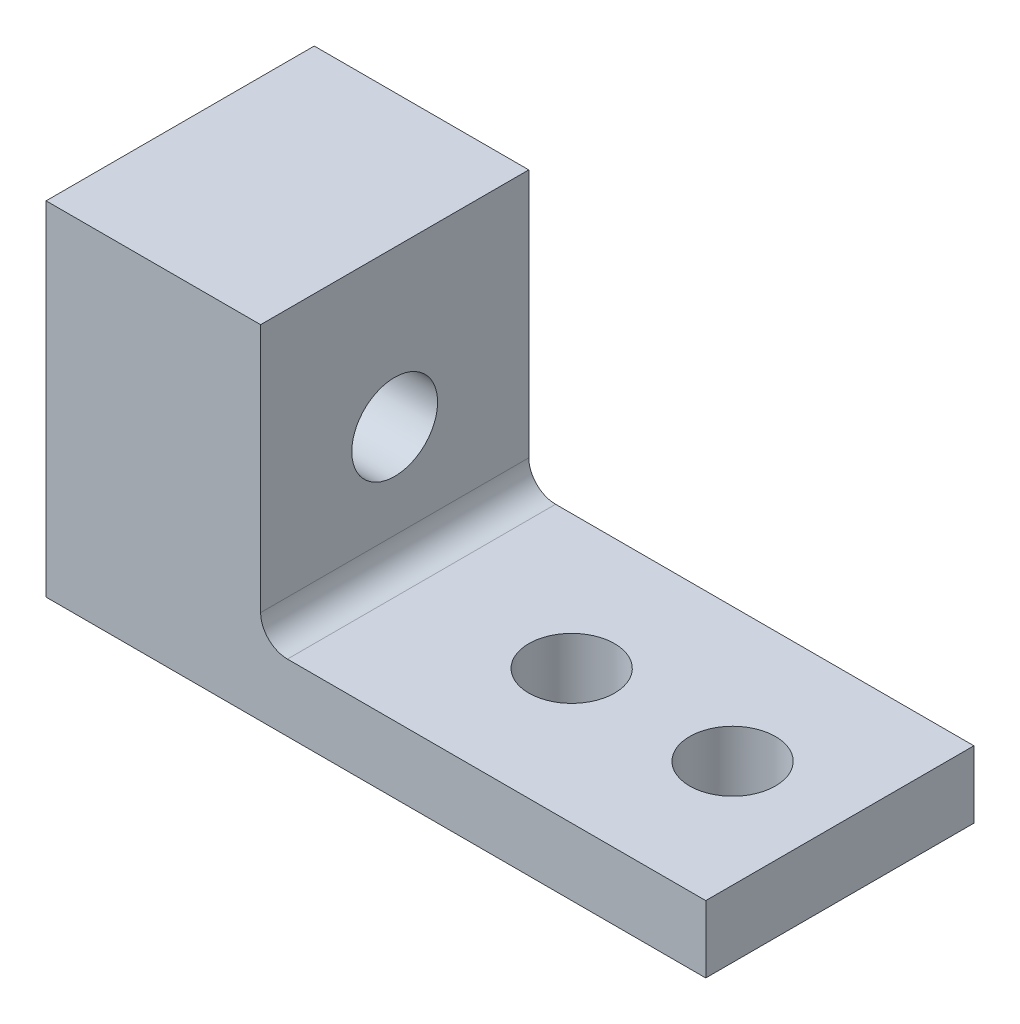
ISO-10303-21;
HEADER;
FILE_DESCRIPTION(('STEP AP214'),'2;1');
FILE_NAME('part.step','',(''),(''),'','','');
FILE_SCHEMA(('AUTOMOTIVE_DESIGN { 1 0 10303 214 1 1 1 1 }'));
ENDSEC;
DATA;
#1=APPLICATION_CONTEXT('core data for automotive mechanical design processes');
#2=APPLICATION_PROTOCOL_DEFINITION('international standard','automotive_design',2000,#1);
#3=PRODUCT_CONTEXT('',#1,'mechanical');
#4=PRODUCT('Part','Part','',(#3));
#5=PRODUCT_RELATED_PRODUCT_CATEGORY('part','',(#4));
#6=PRODUCT_DEFINITION_FORMATION('','',#4);
#7=PRODUCT_DEFINITION_CONTEXT('part definition',#1,'design');
#8=PRODUCT_DEFINITION('design','',#6,#7);
#9=PRODUCT_DEFINITION_SHAPE('','',#8);
#10=(LENGTH_UNIT() NAMED_UNIT(*) SI_UNIT(.MILLI.,.METRE.));
#11=(NAMED_UNIT(*) PLANE_ANGLE_UNIT() SI_UNIT($,.RADIAN.));
#12=(NAMED_UNIT(*) SI_UNIT($,.STERADIAN.) SOLID_ANGLE_UNIT());
#13=UNCERTAINTY_MEASURE_WITH_UNIT(LENGTH_MEASURE(1.E-05),#10,'distance_accuracy_value','');
#14=(GEOMETRIC_REPRESENTATION_CONTEXT(3) GLOBAL_UNCERTAINTY_ASSIGNED_CONTEXT((#13)) GLOBAL_UNIT_ASSIGNED_CONTEXT((#10,
#11,#12)) REPRESENTATION_CONTEXT('',''));
#15=CARTESIAN_POINT('',(0.,0.,0.));
#16=DIRECTION('',(0.,0.,1.));
#17=DIRECTION('',(1.,0.,0.));
#18=AXIS2_PLACEMENT_3D('',#15,#16,#17);
#19=CARTESIAN_POINT('',(31.242,0.,-6.35));
#20=DIRECTION('',(0.,-1.,0.));
#21=DIRECTION('',(0.,0.,-1.));
#22=AXIS2_PLACEMENT_3D('',#19,#20,#21);
#23=PLANE('',#22);
#24=CARTESIAN_POINT('',(26.162,0.,0.));
#25=DIRECTION('',(0.,-1.,0.));
#26=DIRECTION('',(1.,0.,0.));
#27=AXIS2_PLACEMENT_3D('',#24,#25,#26);
#28=CIRCLE('',#27,2.032);
#29=CARTESIAN_POINT('',(28.194,0.,0.));
#30=VERTEX_POINT('',#29);
#31=EDGE_CURVE('E252',#30,#30,#28,.T.);
#32=ORIENTED_EDGE('',*,*,#31,.F.);
#33=EDGE_LOOP('',(#32));
#34=FACE_BOUND('',#33,.T.);
#35=CARTESIAN_POINT('',(18.542,0.,0.));
#36=DIRECTION('',(0.,-1.,0.));
#37=DIRECTION('',(1.,0.,0.));
#38=AXIS2_PLACEMENT_3D('',#35,#36,#37);
#39=CIRCLE('',#38,2.032);
#40=CARTESIAN_POINT('',(20.574,0.,0.));
#41=VERTEX_POINT('',#40);
#42=EDGE_CURVE('E246',#41,#41,#39,.T.);
#43=ORIENTED_EDGE('',*,*,#42,.F.);
#44=EDGE_LOOP('',(#43));
#45=FACE_BOUND('',#44,.T.);
#46=DIRECTION('',(1.,0.,0.));
#47=VECTOR('',#46,1.);
#48=CARTESIAN_POINT('',(31.242,0.,6.35));
#49=LINE('',#48,#47);
#50=CARTESIAN_POINT('',(0.,0.,6.35));
#51=VERTEX_POINT('',#50);
#52=CARTESIAN_POINT('',(31.242,0.,6.35));
#53=VERTEX_POINT('',#52);
#54=EDGE_CURVE('E151',#51,#53,#49,.T.);
#55=ORIENTED_EDGE('',*,*,#54,.F.);
#56=DIRECTION('',(0.,0.,1.));
#57=VECTOR('',#56,1.);
#58=CARTESIAN_POINT('',(0.,0.,-6.35));
#59=LINE('',#58,#57);
#60=CARTESIAN_POINT('',(0.,0.,-6.35));
#61=VERTEX_POINT('',#60);
#62=EDGE_CURVE('E128',#61,#51,#59,.T.);
#63=ORIENTED_EDGE('',*,*,#62,.F.);
#64=DIRECTION('',(1.,0.,0.));
#65=VECTOR('',#64,1.);
#66=CARTESIAN_POINT('',(31.242,0.,-6.35));
#67=LINE('',#66,#65);
#68=CARTESIAN_POINT('',(31.242,0.,-6.35));
#69=VERTEX_POINT('',#68);
#70=EDGE_CURVE('E122',#61,#69,#67,.T.);
#71=ORIENTED_EDGE('',*,*,#70,.T.);
#72=DIRECTION('',(0.,0.,1.));
#73=VECTOR('',#72,1.);
#74=CARTESIAN_POINT('',(31.242,0.,-6.35));
#75=LINE('',#74,#73);
#76=EDGE_CURVE('E103',#69,#53,#75,.T.);
#77=ORIENTED_EDGE('',*,*,#76,.T.);
#78=EDGE_LOOP('',(#55,#63,#71,#77));
#79=FACE_BOUND('',#78,.T.);
#80=ADVANCED_FACE('F45',(#34,#45,#79),#23,.T.);
#81=CARTESIAN_POINT('',(0.,0.,-6.35));
#82=DIRECTION('',(-1.,0.,0.));
#83=DIRECTION('',(0.,0.,1.));
#84=AXIS2_PLACEMENT_3D('',#81,#82,#83);
#85=PLANE('',#84);
#86=CARTESIAN_POINT('',(0.,8.89,0.));
#87=DIRECTION('',(-1.,0.,0.));
#88=DIRECTION('',(0.,0.,1.));
#89=AXIS2_PLACEMENT_3D('',#86,#87,#88);
#90=CIRCLE('',#89,2.032);
#91=CARTESIAN_POINT('',(0.,8.89,2.032));
#92=VERTEX_POINT('',#91);
#93=EDGE_CURVE('E154',#92,#92,#90,.T.);
#94=ORIENTED_EDGE('',*,*,#93,.F.);
#95=EDGE_LOOP('',(#94));
#96=FACE_BOUND('',#95,.T.);
#97=DIRECTION('',(0.,-1.,0.));
#98=VECTOR('',#97,1.);
#99=CARTESIAN_POINT('',(0.,0.,6.35));
#100=LINE('',#99,#98);
#101=CARTESIAN_POINT('',(0.,16.256,6.35));
#102=VERTEX_POINT('',#101);
#103=EDGE_CURVE('E130',#102,#51,#100,.T.);
#104=ORIENTED_EDGE('',*,*,#103,.F.);
#105=DIRECTION('',(0.,0.,1.));
#106=VECTOR('',#105,1.);
#107=CARTESIAN_POINT('',(0.,16.256,-6.35));
#108=LINE('',#107,#106);
#109=CARTESIAN_POINT('',(0.,16.256,-6.35));
#110=VERTEX_POINT('',#109);
#111=EDGE_CURVE('E169',#110,#102,#108,.T.);
#112=ORIENTED_EDGE('',*,*,#111,.F.);
#113=DIRECTION('',(0.,-1.,0.));
#114=VECTOR('',#113,1.);
#115=CARTESIAN_POINT('',(0.,0.,-6.35));
#116=LINE('',#115,#114);
#117=EDGE_CURVE('E115',#110,#61,#116,.T.);
#118=ORIENTED_EDGE('',*,*,#117,.T.);
#119=ORIENTED_EDGE('',*,*,#62,.T.);
#120=EDGE_LOOP('',(#104,#112,#118,#119));
#121=FACE_BOUND('',#120,.T.);
#122=ADVANCED_FACE('F193',(#96,#121),#85,.T.);
#123=CARTESIAN_POINT('',(0.,16.256,-6.35));
#124=DIRECTION('',(0.,1.,0.));
#125=DIRECTION('',(0.,0.,1.));
#126=AXIS2_PLACEMENT_3D('',#123,#124,#125);
#127=PLANE('',#126);
#128=DIRECTION('',(-1.,0.,0.));
#129=VECTOR('',#128,1.);
#130=CARTESIAN_POINT('',(0.,16.256,6.35));
#131=LINE('',#130,#129);
#132=CARTESIAN_POINT('',(10.16,16.256,6.35));
#133=VERTEX_POINT('',#132);
#134=EDGE_CURVE('E134',#133,#102,#131,.T.);
#135=ORIENTED_EDGE('',*,*,#134,.F.);
#136=DIRECTION('',(0.,0.,1.));
#137=VECTOR('',#136,1.);
#138=CARTESIAN_POINT('',(10.16,16.256,-6.35));
#139=LINE('',#138,#137);
#140=CARTESIAN_POINT('',(10.16,16.256,-6.35));
#141=VERTEX_POINT('',#140);
#142=EDGE_CURVE('E172',#141,#133,#139,.T.);
#143=ORIENTED_EDGE('',*,*,#142,.F.);
#144=DIRECTION('',(-1.,0.,0.));
#145=VECTOR('',#144,1.);
#146=CARTESIAN_POINT('',(0.,16.256,-6.35));
#147=LINE('',#146,#145);
#148=EDGE_CURVE('E145',#141,#110,#147,.T.);
#149=ORIENTED_EDGE('',*,*,#148,.T.);
#150=ORIENTED_EDGE('',*,*,#111,.T.);
#151=EDGE_LOOP('',(#135,#143,#149,#150));
#152=FACE_BOUND('',#151,.T.);
#153=ADVANCED_FACE('F197',(#152),#127,.T.);
#154=CARTESIAN_POINT('',(10.16,16.256,-6.35));
#155=DIRECTION('',(1.,0.,0.));
#156=DIRECTION('',(0.,1.,0.));
#157=AXIS2_PLACEMENT_3D('',#154,#155,#156);
#158=PLANE('',#157);
#159=CARTESIAN_POINT('',(10.16,8.89,0.));
#160=DIRECTION('',(1.,0.,0.));
#161=DIRECTION('',(0.,1.,0.));
#162=AXIS2_PLACEMENT_3D('',#159,#160,#161);
#163=CIRCLE('',#162,2.032);
#164=CARTESIAN_POINT('',(10.16,10.922,0.));
#165=VERTEX_POINT('',#164);
#166=EDGE_CURVE('E137',#165,#165,#163,.F.);
#167=ORIENTED_EDGE('',*,*,#166,.T.);
#168=EDGE_LOOP('',(#167));
#169=FACE_BOUND('',#168,.T.);
#170=DIRECTION('',(0.,1.,0.));
#171=VECTOR('',#170,1.);
#172=CARTESIAN_POINT('',(10.16,16.256,6.35));
#173=LINE('',#172,#171);
#174=CARTESIAN_POINT('',(10.16,4.445,6.35));
#175=VERTEX_POINT('',#174);
#176=EDGE_CURVE('E160',#175,#133,#173,.T.);
#177=ORIENTED_EDGE('',*,*,#176,.F.);
#178=DIRECTION('',(0.,0.,1.));
#179=VECTOR('',#178,1.);
#180=CARTESIAN_POINT('',(10.16,4.445,-6.35));
#181=LINE('',#180,#179);
#182=CARTESIAN_POINT('',(10.16,4.445,-6.35));
#183=VERTEX_POINT('',#182);
#184=EDGE_CURVE('E61',#175,#183,#181,.F.);
#185=ORIENTED_EDGE('',*,*,#184,.T.);
#186=DIRECTION('',(0.,1.,0.));
#187=VECTOR('',#186,1.);
#188=CARTESIAN_POINT('',(10.16,16.256,-6.35));
#189=LINE('',#188,#187);
#190=EDGE_CURVE('E142',#183,#141,#189,.T.);
#191=ORIENTED_EDGE('',*,*,#190,.T.);
#192=ORIENTED_EDGE('',*,*,#142,.T.);
#193=EDGE_LOOP('',(#177,#185,#191,#192));
#194=FACE_BOUND('',#193,.T.);
#195=ADVANCED_FACE('F198',(#169,#194),#158,.T.);
#196=CARTESIAN_POINT('',(10.16,3.175,-6.35));
#197=DIRECTION('',(0.,1.,0.));
#198=DIRECTION('',(0.,0.,1.));
#199=AXIS2_PLACEMENT_3D('',#196,#197,#198);
#200=PLANE('',#199);
#201=CARTESIAN_POINT('',(26.162,3.175,0.));
#202=DIRECTION('',(0.,1.,0.));
#203=DIRECTION('',(0.,0.,1.));
#204=AXIS2_PLACEMENT_3D('',#201,#202,#203);
#205=CIRCLE('',#204,2.032);
#206=CARTESIAN_POINT('',(26.162,3.175,2.032));
#207=VERTEX_POINT('',#206);
#208=EDGE_CURVE('E256',#207,#207,#205,.F.);
#209=ORIENTED_EDGE('',*,*,#208,.T.);
#210=EDGE_LOOP('',(#209));
#211=FACE_BOUND('',#210,.T.);
#212=CARTESIAN_POINT('',(18.542,3.175,0.));
#213=DIRECTION('',(0.,1.,0.));
#214=DIRECTION('',(0.,0.,1.));
#215=AXIS2_PLACEMENT_3D('',#212,#213,#214);
#216=CIRCLE('',#215,2.032);
#217=CARTESIAN_POINT('',(18.542,3.175,2.032));
#218=VERTEX_POINT('',#217);
#219=EDGE_CURVE('E248',#218,#218,#216,.F.);
#220=ORIENTED_EDGE('',*,*,#219,.T.);
#221=EDGE_LOOP('',(#220));
#222=FACE_BOUND('',#221,.T.);
#223=DIRECTION('',(-1.,0.,0.));
#224=VECTOR('',#223,1.);
#225=CARTESIAN_POINT('',(10.16,3.175,-6.35));
#226=LINE('',#225,#224);
#227=CARTESIAN_POINT('',(31.242,3.175,-6.35));
#228=VERTEX_POINT('',#227);
#229=CARTESIAN_POINT('',(11.43,3.175,-6.35));
#230=VERTEX_POINT('',#229);
#231=EDGE_CURVE('E125',#228,#230,#226,.T.);
#232=ORIENTED_EDGE('',*,*,#231,.T.);
#233=DIRECTION('',(0.,0.,1.));
#234=VECTOR('',#233,1.);
#235=CARTESIAN_POINT('',(11.43,3.175,6.35));
#236=LINE('',#235,#234);
#237=CARTESIAN_POINT('',(11.43,3.175,6.35));
#238=VERTEX_POINT('',#237);
#239=EDGE_CURVE('E168',#230,#238,#236,.T.);
#240=ORIENTED_EDGE('',*,*,#239,.T.);
#241=DIRECTION('',(-1.,0.,0.));
#242=VECTOR('',#241,1.);
#243=CARTESIAN_POINT('',(10.16,3.175,6.35));
#244=LINE('',#243,#242);
#245=CARTESIAN_POINT('',(31.242,3.175,6.35));
#246=VERTEX_POINT('',#245);
#247=EDGE_CURVE('E157',#246,#238,#244,.T.);
#248=ORIENTED_EDGE('',*,*,#247,.F.);
#249=DIRECTION('',(0.,0.,1.));
#250=VECTOR('',#249,1.);
#251=CARTESIAN_POINT('',(31.242,3.175,-6.35));
#252=LINE('',#251,#250);
#253=EDGE_CURVE('E114',#228,#246,#252,.T.);
#254=ORIENTED_EDGE('',*,*,#253,.F.);
#255=EDGE_LOOP('',(#232,#240,#248,#254));
#256=FACE_BOUND('',#255,.T.);
#257=ADVANCED_FACE('F186',(#211,#222,#256),#200,.T.);
#258=CARTESIAN_POINT('',(31.242,3.175,-6.35));
#259=DIRECTION('',(1.,0.,0.));
#260=DIRECTION('',(0.,1.,0.));
#261=AXIS2_PLACEMENT_3D('',#258,#259,#260);
#262=PLANE('',#261);
#263=DIRECTION('',(0.,1.,0.));
#264=VECTOR('',#263,1.);
#265=CARTESIAN_POINT('',(31.242,3.175,6.35));
#266=LINE('',#265,#264);
#267=EDGE_CURVE('E108',#53,#246,#266,.T.);
#268=ORIENTED_EDGE('',*,*,#267,.F.);
#269=ORIENTED_EDGE('',*,*,#76,.F.);
#270=DIRECTION('',(0.,1.,0.));
#271=VECTOR('',#270,1.);
#272=CARTESIAN_POINT('',(31.242,3.175,-6.35));
#273=LINE('',#272,#271);
#274=EDGE_CURVE('E106',#69,#228,#273,.T.);
#275=ORIENTED_EDGE('',*,*,#274,.T.);
#276=ORIENTED_EDGE('',*,*,#253,.T.);
#277=EDGE_LOOP('',(#268,#269,#275,#276));
#278=FACE_BOUND('',#277,.T.);
#279=ADVANCED_FACE('F105',(#278),#262,.T.);
#280=CARTESIAN_POINT('',(0.,0.,-6.35));
#281=DIRECTION('',(0.,0.,-1.));
#282=DIRECTION('',(-1.,0.,0.));
#283=AXIS2_PLACEMENT_3D('',#280,#281,#282);
#284=PLANE('',#283);
#285=ORIENTED_EDGE('',*,*,#70,.F.);
#286=ORIENTED_EDGE('',*,*,#117,.F.);
#287=ORIENTED_EDGE('',*,*,#148,.F.);
#288=ORIENTED_EDGE('',*,*,#190,.F.);
#289=CARTESIAN_POINT('',(11.43,4.445,-6.35));
#290=DIRECTION('',(0.,0.,-1.));
#291=DIRECTION('',(-1.,0.,0.));
#292=AXIS2_PLACEMENT_3D('',#289,#290,#291);
#293=CIRCLE('',#292,1.27);
#294=EDGE_CURVE('E11',#183,#230,#293,.F.);
#295=ORIENTED_EDGE('',*,*,#294,.T.);
#296=ORIENTED_EDGE('',*,*,#231,.F.);
#297=ORIENTED_EDGE('',*,*,#274,.F.);
#298=EDGE_LOOP('',(#285,#286,#287,#288,#295,#296,#297));
#299=FACE_BOUND('',#298,.T.);
#300=ADVANCED_FACE('F120',(#299),#284,.T.);
#301=CARTESIAN_POINT('',(0.,0.,6.35));
#302=DIRECTION('',(0.,0.,-1.));
#303=DIRECTION('',(-1.,0.,0.));
#304=AXIS2_PLACEMENT_3D('',#301,#302,#303);
#305=PLANE('',#304);
#306=ORIENTED_EDGE('',*,*,#54,.T.);
#307=ORIENTED_EDGE('',*,*,#267,.T.);
#308=ORIENTED_EDGE('',*,*,#247,.T.);
#309=CARTESIAN_POINT('',(11.43,4.445,6.35));
#310=DIRECTION('',(0.,0.,-1.));
#311=DIRECTION('',(-1.,0.,0.));
#312=AXIS2_PLACEMENT_3D('',#309,#310,#311);
#313=CIRCLE('',#312,1.27);
#314=EDGE_CURVE('E54',#238,#175,#313,.T.);
#315=ORIENTED_EDGE('',*,*,#314,.T.);
#316=ORIENTED_EDGE('',*,*,#176,.T.);
#317=ORIENTED_EDGE('',*,*,#134,.T.);
#318=ORIENTED_EDGE('',*,*,#103,.T.);
#319=EDGE_LOOP('',(#306,#307,#308,#315,#316,#317,#318));
#320=FACE_BOUND('',#319,.T.);
#321=ADVANCED_FACE('F189',(#320),#305,.F.);
#322=CARTESIAN_POINT('',(31.243,8.89,0.));
#323=DIRECTION('',(-1.,0.,0.));
#324=DIRECTION('',(0.,0.,1.));
#325=AXIS2_PLACEMENT_3D('',#322,#323,#324);
#326=CYLINDRICAL_SURFACE('',#325,2.032);
#327=ORIENTED_EDGE('',*,*,#166,.F.);
#328=EDGE_LOOP('',(#327));
#329=FACE_BOUND('',#328,.T.);
#330=ORIENTED_EDGE('',*,*,#93,.T.);
#331=EDGE_LOOP('',(#330));
#332=FACE_BOUND('',#331,.T.);
#333=ADVANCED_FACE('F208',(#329,#332),#326,.F.);
#334=CARTESIAN_POINT('',(18.542,16.257,0.));
#335=DIRECTION('',(0.,-1.,0.));
#336=DIRECTION('',(1.,0.,0.));
#337=AXIS2_PLACEMENT_3D('',#334,#335,#336);
#338=CYLINDRICAL_SURFACE('',#337,2.032);
#339=ORIENTED_EDGE('',*,*,#219,.F.);
#340=EDGE_LOOP('',(#339));
#341=FACE_BOUND('',#340,.T.);
#342=ORIENTED_EDGE('',*,*,#42,.T.);
#343=EDGE_LOOP('',(#342));
#344=FACE_BOUND('',#343,.T.);
#345=ADVANCED_FACE('F201',(#341,#344),#338,.F.);
#346=CARTESIAN_POINT('',(11.43,4.445,-6.35));
#347=DIRECTION('',(0.,0.,-1.));
#348=DIRECTION('',(-1.,0.,0.));
#349=AXIS2_PLACEMENT_3D('',#346,#347,#348);
#350=CYLINDRICAL_SURFACE('',#349,1.27);
#351=ORIENTED_EDGE('',*,*,#294,.F.);
#352=ORIENTED_EDGE('',*,*,#184,.F.);
#353=ORIENTED_EDGE('',*,*,#314,.F.);
#354=ORIENTED_EDGE('',*,*,#239,.F.);
#355=EDGE_LOOP('',(#351,#352,#353,#354));
#356=FACE_BOUND('',#355,.T.);
#357=ADVANCED_FACE('F47',(#356),#350,.F.);
#358=CARTESIAN_POINT('',(26.162,16.257,0.));
#359=DIRECTION('',(0.,-1.,0.));
#360=DIRECTION('',(1.,0.,0.));
#361=AXIS2_PLACEMENT_3D('',#358,#359,#360);
#362=CYLINDRICAL_SURFACE('',#361,2.032);
#363=ORIENTED_EDGE('',*,*,#208,.F.);
#364=EDGE_LOOP('',(#363));
#365=FACE_BOUND('',#364,.T.);
#366=ORIENTED_EDGE('',*,*,#31,.T.);
#367=EDGE_LOOP('',(#366));
#368=FACE_BOUND('',#367,.T.);
#369=ADVANCED_FACE('F200',(#365,#368),#362,.F.);
#370=CLOSED_SHELL('',(#80,#122,#153,#195,#257,#279,#300,#321,#333,#345,#357,#369));
#371=MANIFOLD_SOLID_BREP('B2',#370);
#372=ADVANCED_BREP_SHAPE_REPRESENTATION('',(#18,#371),#14);
#373=SHAPE_DEFINITION_REPRESENTATION(#9,#372);
ENDSEC;
END-ISO-10303-21;
